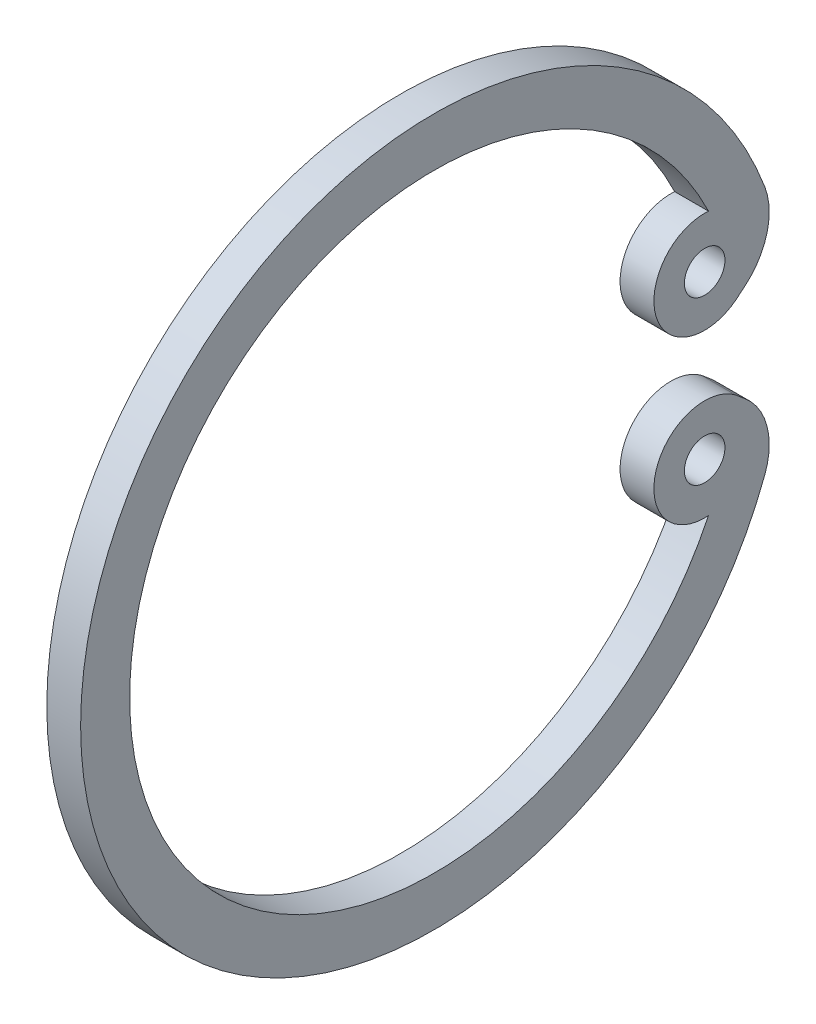
ISO-10303-21;
HEADER;
FILE_DESCRIPTION(('STEP AP214'),'2;1');
FILE_NAME('part.step','',(''),(''),'','','');
FILE_SCHEMA(('AUTOMOTIVE_DESIGN { 1 0 10303 214 1 1 1 1 }'));
ENDSEC;
DATA;
#1=APPLICATION_CONTEXT('core data for automotive mechanical design processes');
#2=APPLICATION_PROTOCOL_DEFINITION('international standard','automotive_design',2000,#1);
#3=PRODUCT_CONTEXT('',#1,'mechanical');
#4=PRODUCT('Part','Part','',(#3));
#5=PRODUCT_RELATED_PRODUCT_CATEGORY('part','',(#4));
#6=PRODUCT_DEFINITION_FORMATION('','',#4);
#7=PRODUCT_DEFINITION_CONTEXT('part definition',#1,'design');
#8=PRODUCT_DEFINITION('design','',#6,#7);
#9=PRODUCT_DEFINITION_SHAPE('','',#8);
#10=(LENGTH_UNIT() NAMED_UNIT(*) SI_UNIT(.MILLI.,.METRE.));
#11=(NAMED_UNIT(*) PLANE_ANGLE_UNIT() SI_UNIT($,.RADIAN.));
#12=(NAMED_UNIT(*) SI_UNIT($,.STERADIAN.) SOLID_ANGLE_UNIT());
#13=UNCERTAINTY_MEASURE_WITH_UNIT(LENGTH_MEASURE(1.E-05),#10,'distance_accuracy_value','');
#14=(GEOMETRIC_REPRESENTATION_CONTEXT(3) GLOBAL_UNCERTAINTY_ASSIGNED_CONTEXT((#13)) GLOBAL_UNIT_ASSIGNED_CONTEXT((#10,
#11,#12)) REPRESENTATION_CONTEXT('',''));
#15=CARTESIAN_POINT('',(0.,0.,0.));
#16=DIRECTION('',(0.,0.,1.));
#17=DIRECTION('',(1.,0.,0.));
#18=AXIS2_PLACEMENT_3D('',#15,#16,#17);
#19=CARTESIAN_POINT('',(18.2222222222222,-0.000147041112859528,9.96274687913538));
#20=DIRECTION('',(1.,0.,0.));
#21=DIRECTION('',(0.,0.,-1.));
#22=AXIS2_PLACEMENT_3D('',#19,#20,#21);
#23=CYLINDRICAL_SURFACE('',#22,5.0000000745058);
#24=CARTESIAN_POINT('',(18.7777777777778,-0.000147041112859528,9.96274687913538));
#25=DIRECTION('',(-1.,0.,0.));
#26=DIRECTION('',(0.,0.,1.));
#27=AXIS2_PLACEMENT_3D('',#24,#25,#26);
#28=CIRCLE('',#27,5.0000000745058);
#29=CARTESIAN_POINT('',(18.7777777777778,-2.16492810406184,5.45567203012793));
#30=VERTEX_POINT('',#29);
#31=CARTESIAN_POINT('',(18.7777777777778,2.16463402183612,5.45567203012794));
#32=VERTEX_POINT('',#31);
#33=EDGE_CURVE('E134',#30,#32,#28,.T.);
#34=ORIENTED_EDGE('',*,*,#33,.F.);
#35=DIRECTION('',(1.,0.,0.));
#36=VECTOR('',#35,1.);
#37=CARTESIAN_POINT('',(18.2222222222222,-2.16492810406184,5.45567203012793));
#38=LINE('',#37,#36);
#39=CARTESIAN_POINT('',(18.2222222222222,-2.16492810406184,5.45567203012793));
#40=VERTEX_POINT('',#39);
#41=EDGE_CURVE('E11',#40,#30,#38,.T.);
#42=ORIENTED_EDGE('',*,*,#41,.F.);
#43=CARTESIAN_POINT('',(18.2222222222222,-0.000147041112859528,9.96274687913538));
#44=DIRECTION('',(-1.,0.,0.));
#45=DIRECTION('',(0.,0.,1.));
#46=AXIS2_PLACEMENT_3D('',#43,#44,#45);
#47=CIRCLE('',#46,5.0000000745058);
#48=CARTESIAN_POINT('',(18.2222222222222,2.16463402183612,5.45567203012794));
#49=VERTEX_POINT('',#48);
#50=EDGE_CURVE('E155',#40,#49,#47,.T.);
#51=ORIENTED_EDGE('',*,*,#50,.T.);
#52=DIRECTION('',(1.,0.,0.));
#53=VECTOR('',#52,1.);
#54=CARTESIAN_POINT('',(18.2222222222222,2.16463402183612,5.45567203012794));
#55=LINE('',#54,#53);
#56=EDGE_CURVE('E40',#49,#32,#55,.T.);
#57=ORIENTED_EDGE('',*,*,#56,.T.);
#58=EDGE_LOOP('',(#34,#42,#51,#57));
#59=FACE_BOUND('',#58,.T.);
#60=ADVANCED_FACE('F37',(#59),#23,.F.);
#61=CARTESIAN_POINT('',(18.2222222222222,-1.33365633381796,5.51874951995459));
#62=DIRECTION('',(1.,0.,0.));
#63=DIRECTION('',(0.,0.,-1.));
#64=AXIS2_PLACEMENT_3D('',#61,#62,#63);
#65=CYLINDRICAL_SURFACE('',#64,0.833661517480095);
#66=CARTESIAN_POINT('',(18.7777777777778,-1.33365633381796,5.51874951995459));
#67=DIRECTION('',(1.,0.,0.));
#68=DIRECTION('',(0.,0.,-1.));
#69=AXIS2_PLACEMENT_3D('',#66,#67,#68);
#70=CIRCLE('',#69,0.833661517480095);
#71=CARTESIAN_POINT('',(18.7777777777778,-0.674281234249103,5.00863580342094));
#72=VERTEX_POINT('',#71);
#73=EDGE_CURVE('E153',#72,#30,#70,.T.);
#74=ORIENTED_EDGE('',*,*,#73,.F.);
#75=DIRECTION('',(1.,0.,0.));
#76=VECTOR('',#75,1.);
#77=CARTESIAN_POINT('',(18.2222222222222,-0.674281234249103,5.00863580342094));
#78=LINE('',#77,#76);
#79=CARTESIAN_POINT('',(18.2222222222222,-0.674281234249103,5.00863580342094));
#80=VERTEX_POINT('',#79);
#81=EDGE_CURVE('E46',#80,#72,#78,.T.);
#82=ORIENTED_EDGE('',*,*,#81,.F.);
#83=CARTESIAN_POINT('',(18.2222222222222,-1.33365633381796,5.51874951995459));
#84=DIRECTION('',(1.,0.,0.));
#85=DIRECTION('',(0.,0.,-1.));
#86=AXIS2_PLACEMENT_3D('',#83,#84,#85);
#87=CIRCLE('',#86,0.833661517480095);
#88=EDGE_CURVE('E124',#80,#40,#87,.T.);
#89=ORIENTED_EDGE('',*,*,#88,.T.);
#90=ORIENTED_EDGE('',*,*,#41,.T.);
#91=EDGE_LOOP('',(#74,#82,#89,#90));
#92=FACE_BOUND('',#91,.T.);
#93=ADVANCED_FACE('F167',(#92),#65,.T.);
#94=CARTESIAN_POINT('',(18.2222222222222,-0.802907432131767,4.85534506999254));
#95=DIRECTION('',(0.,0.766044443118982,-0.642787609686534));
#96=DIRECTION('',(0.,0.642787609686534,0.766044443118982));
#97=AXIS2_PLACEMENT_3D('',#94,#95,#96);
#98=PLANE('',#97);
#99=DIRECTION('',(0.,0.642787609686534,0.766044443118982));
#100=VECTOR('',#99,1.);
#101=CARTESIAN_POINT('',(18.7777777777778,-0.802907432131767,4.85534506999254));
#102=LINE('',#101,#100);
#103=CARTESIAN_POINT('',(18.7777777777778,-0.802907432131767,4.85534506999254));
#104=VERTEX_POINT('',#103);
#105=EDGE_CURVE('E111',#104,#72,#102,.T.);
#106=ORIENTED_EDGE('',*,*,#105,.F.);
#107=DIRECTION('',(1.,0.,0.));
#108=VECTOR('',#107,1.);
#109=CARTESIAN_POINT('',(18.2222222222222,-0.802907432131767,4.85534506999254));
#110=LINE('',#109,#108);
#111=CARTESIAN_POINT('',(18.2222222222222,-0.802907432131767,4.85534506999254));
#112=VERTEX_POINT('',#111);
#113=EDGE_CURVE('E106',#112,#104,#110,.T.);
#114=ORIENTED_EDGE('',*,*,#113,.F.);
#115=DIRECTION('',(0.,0.642787609686534,0.766044443118982));
#116=VECTOR('',#115,1.);
#117=CARTESIAN_POINT('',(18.2222222222222,-0.802907432131767,4.85534506999254));
#118=LINE('',#117,#116);
#119=EDGE_CURVE('E109',#112,#80,#118,.T.);
#120=ORIENTED_EDGE('',*,*,#119,.T.);
#121=ORIENTED_EDGE('',*,*,#81,.T.);
#122=EDGE_LOOP('',(#106,#114,#120,#121));
#123=FACE_BOUND('',#122,.T.);
#124=ADVANCED_FACE('F108',(#123),#98,.T.);
#125=CARTESIAN_POINT('',(18.2222222222222,-1.65406792448619,5.56955352519981));
#126=DIRECTION('',(1.,0.,0.));
#127=DIRECTION('',(0.,0.,-1.));
#128=AXIS2_PLACEMENT_3D('',#125,#126,#127);
#129=CYLINDRICAL_SURFACE('',#128,1.11111111111111);
#130=CARTESIAN_POINT('',(18.7777777777778,-1.65406792448619,5.56955352519981));
#131=DIRECTION('',(1.,0.,0.));
#132=DIRECTION('',(0.,0.,-1.));
#133=AXIS2_PLACEMENT_3D('',#130,#131,#132);
#134=CIRCLE('',#133,1.11111111111111);
#135=CARTESIAN_POINT('',(18.7777777777778,-2.04554808732343,4.52969238863421));
#136=VERTEX_POINT('',#135);
#137=EDGE_CURVE('E150',#136,#104,#134,.T.);
#138=ORIENTED_EDGE('',*,*,#137,.F.);
#139=DIRECTION('',(1.,0.,0.));
#140=VECTOR('',#139,1.);
#141=CARTESIAN_POINT('',(18.2222222222222,-2.04554808732343,4.52969238863421));
#142=LINE('',#141,#140);
#143=CARTESIAN_POINT('',(18.2222222222222,-2.04554808732343,4.52969238863421));
#144=VERTEX_POINT('',#143);
#145=EDGE_CURVE('E116',#144,#136,#142,.T.);
#146=ORIENTED_EDGE('',*,*,#145,.F.);
#147=CARTESIAN_POINT('',(18.2222222222222,-1.65406792448619,5.56955352519981));
#148=DIRECTION('',(1.,0.,0.));
#149=DIRECTION('',(0.,0.,-1.));
#150=AXIS2_PLACEMENT_3D('',#147,#148,#149);
#151=CIRCLE('',#150,1.11111111111111);
#152=EDGE_CURVE('E122',#144,#112,#151,.T.);
#153=ORIENTED_EDGE('',*,*,#152,.T.);
#154=ORIENTED_EDGE('',*,*,#113,.T.);
#155=EDGE_LOOP('',(#138,#146,#153,#154));
#156=FACE_BOUND('',#155,.T.);
#157=ADVANCED_FACE('F126',(#156),#129,.T.);
#158=CARTESIAN_POINT('',(18.2222222222222,-0.000147041112859528,9.96274687913538));
#159=DIRECTION('',(1.,0.,0.));
#160=DIRECTION('',(0.,0.,-1.));
#161=AXIS2_PLACEMENT_3D('',#158,#159,#160);
#162=CYLINDRICAL_SURFACE('',#161,5.80532053693801);
#163=CARTESIAN_POINT('',(18.7777777777778,-0.000147041112859528,9.96274687913538));
#164=DIRECTION('',(1.,0.,0.));
#165=DIRECTION('',(0.,0.,-1.));
#166=AXIS2_PLACEMENT_3D('',#163,#164,#165);
#167=CIRCLE('',#166,5.80532053693801);
#168=CARTESIAN_POINT('',(18.7777777777778,2.04523528891707,4.52968534252496));
#169=VERTEX_POINT('',#168);
#170=EDGE_CURVE('E147',#169,#136,#167,.T.);
#171=ORIENTED_EDGE('',*,*,#170,.F.);
#172=DIRECTION('',(1.,0.,0.));
#173=VECTOR('',#172,1.);
#174=CARTESIAN_POINT('',(18.2222222222222,2.04523528891707,4.52968534252496));
#175=LINE('',#174,#173);
#176=CARTESIAN_POINT('',(18.2222222222222,2.04523528891707,4.52968534252496));
#177=VERTEX_POINT('',#176);
#178=EDGE_CURVE('E159',#177,#169,#175,.T.);
#179=ORIENTED_EDGE('',*,*,#178,.F.);
#180=CARTESIAN_POINT('',(18.2222222222222,-0.000147041112859528,9.96274687913538));
#181=DIRECTION('',(1.,0.,0.));
#182=DIRECTION('',(0.,0.,-1.));
#183=AXIS2_PLACEMENT_3D('',#180,#181,#182);
#184=CIRCLE('',#183,5.80532053693801);
#185=EDGE_CURVE('E127',#177,#144,#184,.T.);
#186=ORIENTED_EDGE('',*,*,#185,.T.);
#187=ORIENTED_EDGE('',*,*,#145,.T.);
#188=EDGE_LOOP('',(#171,#179,#186,#187));
#189=FACE_BOUND('',#188,.T.);
#190=ADVANCED_FACE('F180',(#189),#162,.T.);
#191=CARTESIAN_POINT('',(18.2222222222222,1.65375870826899,5.5695478276828));
#192=DIRECTION('',(1.,0.,0.));
#193=DIRECTION('',(0.,0.,-1.));
#194=AXIS2_PLACEMENT_3D('',#191,#192,#193);
#195=CYLINDRICAL_SURFACE('',#194,1.11111111111111);
#196=CARTESIAN_POINT('',(18.7777777777778,1.65375870826899,5.5695478276828));
#197=DIRECTION('',(1.,0.,0.));
#198=DIRECTION('',(0.,0.,-1.));
#199=AXIS2_PLACEMENT_3D('',#196,#197,#198);
#200=CIRCLE('',#199,1.11111111111111);
#201=CARTESIAN_POINT('',(18.7777777777778,0.80259821591457,4.85533937247554));
#202=VERTEX_POINT('',#201);
#203=EDGE_CURVE('E144',#202,#169,#200,.T.);
#204=ORIENTED_EDGE('',*,*,#203,.F.);
#205=DIRECTION('',(1.,0.,0.));
#206=VECTOR('',#205,1.);
#207=CARTESIAN_POINT('',(18.2222222222222,0.80259821591457,4.85533937247554));
#208=LINE('',#207,#206);
#209=CARTESIAN_POINT('',(18.2222222222222,0.80259821591457,4.85533937247554));
#210=VERTEX_POINT('',#209);
#211=EDGE_CURVE('E161',#210,#202,#208,.T.);
#212=ORIENTED_EDGE('',*,*,#211,.F.);
#213=CARTESIAN_POINT('',(18.2222222222222,1.65375870826899,5.5695478276828));
#214=DIRECTION('',(1.,0.,0.));
#215=DIRECTION('',(0.,0.,-1.));
#216=AXIS2_PLACEMENT_3D('',#213,#214,#215);
#217=CIRCLE('',#216,1.11111111111111);
#218=EDGE_CURVE('E129',#210,#177,#217,.T.);
#219=ORIENTED_EDGE('',*,*,#218,.T.);
#220=ORIENTED_EDGE('',*,*,#178,.T.);
#221=EDGE_LOOP('',(#204,#212,#219,#220));
#222=FACE_BOUND('',#221,.T.);
#223=ADVANCED_FACE('F183',(#222),#195,.T.);
#224=CARTESIAN_POINT('',(18.2222222222222,0.674491165043935,5.00903173473341));
#225=DIRECTION('',(0.,-0.768147331821205,-0.640273126576435));
#226=DIRECTION('',(0.,0.640273126576435,-0.768147331821205));
#227=AXIS2_PLACEMENT_3D('',#224,#225,#226);
#228=PLANE('',#227);
#229=DIRECTION('',(0.,0.640273126576435,-0.768147331821205));
#230=VECTOR('',#229,1.);
#231=CARTESIAN_POINT('',(18.7777777777778,0.674491165043935,5.00903173473341));
#232=LINE('',#231,#230);
#233=CARTESIAN_POINT('',(18.7777777777778,0.674491165043935,5.00903173473341));
#234=VERTEX_POINT('',#233);
#235=EDGE_CURVE('E141',#234,#202,#232,.T.);
#236=ORIENTED_EDGE('',*,*,#235,.F.);
#237=DIRECTION('',(1.,0.,0.));
#238=VECTOR('',#237,1.);
#239=CARTESIAN_POINT('',(18.2222222222222,0.674491165043935,5.00903173473341));
#240=LINE('',#239,#238);
#241=CARTESIAN_POINT('',(18.2222222222222,0.674491165043935,5.00903173473341));
#242=VERTEX_POINT('',#241);
#243=EDGE_CURVE('E162',#242,#234,#240,.T.);
#244=ORIENTED_EDGE('',*,*,#243,.F.);
#245=DIRECTION('',(0.,0.640273126576435,-0.768147331821205));
#246=VECTOR('',#245,1.);
#247=CARTESIAN_POINT('',(18.2222222222222,0.674491165043935,5.00903173473341));
#248=LINE('',#247,#246);
#249=EDGE_CURVE('E229',#242,#210,#248,.T.);
#250=ORIENTED_EDGE('',*,*,#249,.T.);
#251=ORIENTED_EDGE('',*,*,#211,.T.);
#252=EDGE_LOOP('',(#236,#244,#250,#251));
#253=FACE_BOUND('',#252,.T.);
#254=ADVANCED_FACE('F187',(#253),#228,.T.);
#255=CARTESIAN_POINT('',(18.2222222222222,1.33369730211353,5.5188274911832));
#256=DIRECTION('',(1.,0.,0.));
#257=DIRECTION('',(0.,0.,-1.));
#258=AXIS2_PLACEMENT_3D('',#255,#256,#257);
#259=CYLINDRICAL_SURFACE('',#258,0.833333333333332);
#260=CARTESIAN_POINT('',(18.7777777777778,1.33369730211353,5.5188274911832));
#261=DIRECTION('',(1.,0.,0.));
#262=DIRECTION('',(0.,0.,-1.));
#263=AXIS2_PLACEMENT_3D('',#260,#261,#262);
#264=CIRCLE('',#263,0.833333333333332);
#265=EDGE_CURVE('E137',#32,#234,#264,.T.);
#266=ORIENTED_EDGE('',*,*,#265,.F.);
#267=ORIENTED_EDGE('',*,*,#56,.F.);
#268=CARTESIAN_POINT('',(18.2222222222222,1.33369730211353,5.5188274911832));
#269=DIRECTION('',(1.,0.,0.));
#270=DIRECTION('',(0.,0.,-1.));
#271=AXIS2_PLACEMENT_3D('',#268,#269,#270);
#272=CIRCLE('',#271,0.833333333333332);
#273=EDGE_CURVE('E227',#49,#242,#272,.T.);
#274=ORIENTED_EDGE('',*,*,#273,.T.);
#275=ORIENTED_EDGE('',*,*,#243,.T.);
#276=EDGE_LOOP('',(#266,#267,#274,#275));
#277=FACE_BOUND('',#276,.T.);
#278=ADVANCED_FACE('F164',(#277),#259,.T.);
#279=CARTESIAN_POINT('',(18.2222222222222,-0.000147041112859528,9.96274687913538));
#280=DIRECTION('',(-1.,0.,0.));
#281=DIRECTION('',(0.,0.,1.));
#282=AXIS2_PLACEMENT_3D('',#279,#280,#281);
#283=PLANE('',#282);
#284=CARTESIAN_POINT('',(18.2222222222222,1.3332539620853,5.5185280971041));
#285=DIRECTION('',(1.,0.,0.));
#286=DIRECTION('',(0.,0.,1.));
#287=AXIS2_PLACEMENT_3D('',#284,#285,#286);
#288=CIRCLE('',#287,0.333333333333333);
#289=CARTESIAN_POINT('',(18.2222222222222,1.3332539620853,5.85186143043744));
#290=VERTEX_POINT('',#289);
#291=EDGE_CURVE('E214',#290,#290,#288,.T.);
#292=ORIENTED_EDGE('',*,*,#291,.T.);
#293=EDGE_LOOP('',(#292));
#294=FACE_BOUND('',#293,.T.);
#295=CARTESIAN_POINT('',(18.2222222222222,-1.33341270458137,5.5185280971041));
#296=DIRECTION('',(1.,0.,0.));
#297=DIRECTION('',(0.,0.,1.));
#298=AXIS2_PLACEMENT_3D('',#295,#296,#297);
#299=CIRCLE('',#298,0.333333333333333);
#300=CARTESIAN_POINT('',(18.2222222222222,-1.33341270458137,5.85186143043744));
#301=VERTEX_POINT('',#300);
#302=EDGE_CURVE('E138',#301,#301,#299,.T.);
#303=ORIENTED_EDGE('',*,*,#302,.T.);
#304=EDGE_LOOP('',(#303));
#305=FACE_BOUND('',#304,.T.);
#306=ORIENTED_EDGE('',*,*,#50,.F.);
#307=ORIENTED_EDGE('',*,*,#88,.F.);
#308=ORIENTED_EDGE('',*,*,#119,.F.);
#309=ORIENTED_EDGE('',*,*,#152,.F.);
#310=ORIENTED_EDGE('',*,*,#185,.F.);
#311=ORIENTED_EDGE('',*,*,#218,.F.);
#312=ORIENTED_EDGE('',*,*,#249,.F.);
#313=ORIENTED_EDGE('',*,*,#273,.F.);
#314=EDGE_LOOP('',(#306,#307,#308,#309,#310,#311,#312,#313));
#315=FACE_BOUND('',#314,.T.);
#316=ADVANCED_FACE('F120',(#294,#305,#315),#283,.T.);
#317=CARTESIAN_POINT('',(18.7777777777778,-0.000147041112859528,9.96274687913538));
#318=DIRECTION('',(-1.,0.,0.));
#319=DIRECTION('',(0.,0.,1.));
#320=AXIS2_PLACEMENT_3D('',#317,#318,#319);
#321=PLANE('',#320);
#322=CARTESIAN_POINT('',(18.7777777777778,1.3332539620853,5.5185280971041));
#323=DIRECTION('',(1.,0.,0.));
#324=DIRECTION('',(0.,0.,1.));
#325=AXIS2_PLACEMENT_3D('',#322,#323,#324);
#326=CIRCLE('',#325,0.333333333333333);
#327=CARTESIAN_POINT('',(18.7777777777778,1.3332539620853,5.85186143043744));
#328=VERTEX_POINT('',#327);
#329=EDGE_CURVE('E217',#328,#328,#326,.T.);
#330=ORIENTED_EDGE('',*,*,#329,.F.);
#331=EDGE_LOOP('',(#330));
#332=FACE_BOUND('',#331,.T.);
#333=CARTESIAN_POINT('',(18.7777777777778,-1.33341270458137,5.5185280971041));
#334=DIRECTION('',(1.,0.,0.));
#335=DIRECTION('',(0.,0.,1.));
#336=AXIS2_PLACEMENT_3D('',#333,#334,#335);
#337=CIRCLE('',#336,0.333333333333333);
#338=CARTESIAN_POINT('',(18.7777777777778,-1.33341270458137,5.85186143043744));
#339=VERTEX_POINT('',#338);
#340=EDGE_CURVE('E219',#339,#339,#337,.T.);
#341=ORIENTED_EDGE('',*,*,#340,.F.);
#342=EDGE_LOOP('',(#341));
#343=FACE_BOUND('',#342,.T.);
#344=ORIENTED_EDGE('',*,*,#33,.T.);
#345=ORIENTED_EDGE('',*,*,#265,.T.);
#346=ORIENTED_EDGE('',*,*,#235,.T.);
#347=ORIENTED_EDGE('',*,*,#203,.T.);
#348=ORIENTED_EDGE('',*,*,#170,.T.);
#349=ORIENTED_EDGE('',*,*,#137,.T.);
#350=ORIENTED_EDGE('',*,*,#105,.T.);
#351=ORIENTED_EDGE('',*,*,#73,.T.);
#352=EDGE_LOOP('',(#344,#345,#346,#347,#348,#349,#350,#351));
#353=FACE_BOUND('',#352,.T.);
#354=ADVANCED_FACE('F166',(#332,#343,#353),#321,.F.);
#355=CARTESIAN_POINT('',(18.2222222222222,-1.33341270458137,5.5185280971041));
#356=DIRECTION('',(1.,0.,0.));
#357=DIRECTION('',(0.,0.,-1.));
#358=AXIS2_PLACEMENT_3D('',#355,#356,#357);
#359=CYLINDRICAL_SURFACE('',#358,0.333333333333333);
#360=ORIENTED_EDGE('',*,*,#302,.F.);
#361=EDGE_LOOP('',(#360));
#362=FACE_BOUND('',#361,.T.);
#363=ORIENTED_EDGE('',*,*,#340,.T.);
#364=EDGE_LOOP('',(#363));
#365=FACE_BOUND('',#364,.T.);
#366=ADVANCED_FACE('F199',(#362,#365),#359,.F.);
#367=CARTESIAN_POINT('',(18.2222222222222,1.3332539620853,5.5185280971041));
#368=DIRECTION('',(1.,0.,0.));
#369=DIRECTION('',(0.,0.,-1.));
#370=AXIS2_PLACEMENT_3D('',#367,#368,#369);
#371=CYLINDRICAL_SURFACE('',#370,0.333333333333333);
#372=ORIENTED_EDGE('',*,*,#291,.F.);
#373=EDGE_LOOP('',(#372));
#374=FACE_BOUND('',#373,.T.);
#375=ORIENTED_EDGE('',*,*,#329,.T.);
#376=EDGE_LOOP('',(#375));
#377=FACE_BOUND('',#376,.T.);
#378=ADVANCED_FACE('F206',(#374,#377),#371,.F.);
#379=CLOSED_SHELL('',(#60,#93,#124,#157,#190,#223,#254,#278,#316,#354,#366,#378));
#380=MANIFOLD_SOLID_BREP('B2',#379);
#381=ADVANCED_BREP_SHAPE_REPRESENTATION('',(#18,#380),#14);
#382=SHAPE_DEFINITION_REPRESENTATION(#9,#381);
ENDSEC;
END-ISO-10303-21;
